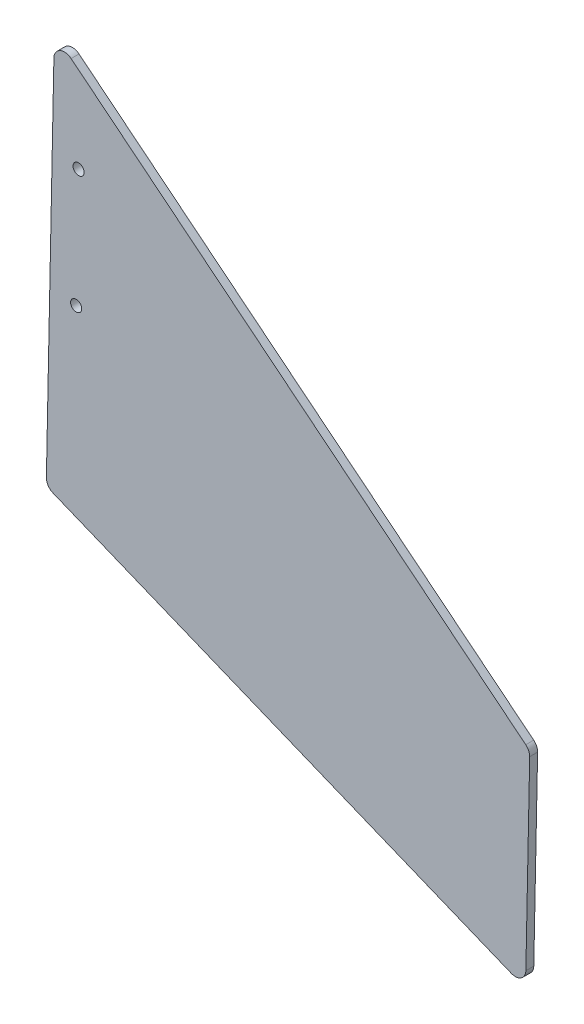
ISO-10303-21;
HEADER;
FILE_DESCRIPTION(('STEP AP214'),'2;1');
FILE_NAME('part.step','',(''),(''),'','','');
FILE_SCHEMA(('AUTOMOTIVE_DESIGN { 1 0 10303 214 1 1 1 1 }'));
ENDSEC;
DATA;
#1=APPLICATION_CONTEXT('core data for automotive mechanical design processes');
#2=APPLICATION_PROTOCOL_DEFINITION('international standard','automotive_design',2000,#1);
#3=PRODUCT_CONTEXT('',#1,'mechanical');
#4=PRODUCT('Part','Part','',(#3));
#5=PRODUCT_RELATED_PRODUCT_CATEGORY('part','',(#4));
#6=PRODUCT_DEFINITION_FORMATION('','',#4);
#7=PRODUCT_DEFINITION_CONTEXT('part definition',#1,'design');
#8=PRODUCT_DEFINITION('design','',#6,#7);
#9=PRODUCT_DEFINITION_SHAPE('','',#8);
#10=(LENGTH_UNIT() NAMED_UNIT(*) SI_UNIT(.MILLI.,.METRE.));
#11=(NAMED_UNIT(*) PLANE_ANGLE_UNIT() SI_UNIT($,.RADIAN.));
#12=(NAMED_UNIT(*) SI_UNIT($,.STERADIAN.) SOLID_ANGLE_UNIT());
#13=UNCERTAINTY_MEASURE_WITH_UNIT(LENGTH_MEASURE(1.E-05),#10,'distance_accuracy_value','');
#14=(GEOMETRIC_REPRESENTATION_CONTEXT(3) GLOBAL_UNCERTAINTY_ASSIGNED_CONTEXT((#13)) GLOBAL_UNIT_ASSIGNED_CONTEXT((#10,
#11,#12)) REPRESENTATION_CONTEXT('',''));
#15=CARTESIAN_POINT('',(0.,0.,0.));
#16=DIRECTION('',(0.,0.,1.));
#17=DIRECTION('',(1.,0.,0.));
#18=AXIS2_PLACEMENT_3D('',#15,#16,#17);
#19=CARTESIAN_POINT('',(178.455758645087,-224.,3.));
#20=DIRECTION('',(-0.999790806275875,0.0204534516948888,0.));
#21=DIRECTION('',(-0.0204534516948888,-0.999790806275875,0.));
#22=AXIS2_PLACEMENT_3D('',#19,#20,#21);
#23=PLANE('',#22);
#24=DIRECTION('',(0.0204534516948888,0.999790806275875,0.));
#25=VECTOR('',#24,1.);
#26=CARTESIAN_POINT('',(178.455758645087,-224.,3.));
#27=LINE('',#26,#25);
#28=CARTESIAN_POINT('',(178.574813412648,-218.180451112785,3.));
#29=VERTEX_POINT('',#28);
#30=CARTESIAN_POINT('',(180.025587190559,-147.264778453809,3.));
#31=VERTEX_POINT('',#30);
#32=EDGE_CURVE('E143',#29,#31,#27,.T.);
#33=ORIENTED_EDGE('',*,*,#32,.F.);
#34=DIRECTION('',(0.,0.,-1.));
#35=VECTOR('',#34,1.);
#36=CARTESIAN_POINT('',(178.574813412648,-218.180451112785,3.));
#37=LINE('',#36,#35);
#38=CARTESIAN_POINT('',(178.574813412648,-218.180451112785,0.));
#39=VERTEX_POINT('',#38);
#40=EDGE_CURVE('E11',#29,#39,#37,.T.);
#41=ORIENTED_EDGE('',*,*,#40,.T.);
#42=DIRECTION('',(0.0204534516948888,0.999790806275875,0.));
#43=VECTOR('',#42,1.);
#44=CARTESIAN_POINT('',(178.455758645087,-224.,0.));
#45=LINE('',#44,#43);
#46=CARTESIAN_POINT('',(180.025587190559,-147.264778453809,0.));
#47=VERTEX_POINT('',#46);
#48=EDGE_CURVE('E189',#39,#47,#45,.T.);
#49=ORIENTED_EDGE('',*,*,#48,.T.);
#50=DIRECTION('',(0.,0.,-1.));
#51=VECTOR('',#50,1.);
#52=CARTESIAN_POINT('',(180.025587190559,-147.264778453809,3.));
#53=LINE('',#52,#51);
#54=EDGE_CURVE('E54',#47,#31,#53,.F.);
#55=ORIENTED_EDGE('',*,*,#54,.T.);
#56=EDGE_LOOP('',(#33,#41,#49,#55));
#57=FACE_BOUND('',#56,.T.);
#58=ADVANCED_FACE('F45',(#57),#23,.F.);
#59=CARTESIAN_POINT('',(180.065729766655,-145.302558134247,3.));
#60=DIRECTION('',(-0.627983554847749,-0.778226608926208,0.));
#61=DIRECTION('',(0.778226608926208,-0.627983554847749,0.));
#62=AXIS2_PLACEMENT_3D('',#59,#60,#61);
#63=PLANE('',#62);
#64=DIRECTION('',(-0.778226608926207,0.627983554847749,0.));
#65=VECTOR('',#64,1.);
#66=CARTESIAN_POINT('',(180.065729766655,-145.302558134247,0.));
#67=LINE('',#66,#65);
#68=CARTESIAN_POINT('',(178.538358184846,-144.070058211324,0.));
#69=VERTEX_POINT('',#68);
#70=CARTESIAN_POINT('',(6.3443543096301,-5.11952447638928,0.));
#71=VERTEX_POINT('',#70);
#72=EDGE_CURVE('E150',#69,#71,#67,.T.);
#73=ORIENTED_EDGE('',*,*,#72,.T.);
#74=DIRECTION('',(0.,0.,-1.));
#75=VECTOR('',#74,1.);
#76=CARTESIAN_POINT('',(6.34435430963004,-5.11952447638922,3.));
#77=LINE('',#76,#75);
#78=CARTESIAN_POINT('',(6.3443543096301,-5.11952447638928,3.));
#79=VERTEX_POINT('',#78);
#80=EDGE_CURVE('E61',#71,#79,#77,.F.);
#81=ORIENTED_EDGE('',*,*,#80,.T.);
#82=DIRECTION('',(-0.778226608926207,0.627983554847749,0.));
#83=VECTOR('',#82,1.);
#84=CARTESIAN_POINT('',(180.065729766655,-145.302558134247,3.));
#85=LINE('',#84,#83);
#86=CARTESIAN_POINT('',(178.538358184846,-144.070058211324,3.));
#87=VERTEX_POINT('',#86);
#88=EDGE_CURVE('E148',#87,#79,#85,.T.);
#89=ORIENTED_EDGE('',*,*,#88,.F.);
#90=DIRECTION('',(0.,0.,-1.));
#91=VECTOR('',#90,1.);
#92=CARTESIAN_POINT('',(178.538358184846,-144.070058211324,3.));
#93=LINE('',#92,#91);
#94=EDGE_CURVE('E178',#87,#69,#93,.T.);
#95=ORIENTED_EDGE('',*,*,#94,.T.);
#96=EDGE_LOOP('',(#73,#81,#89,#95));
#97=FACE_BOUND('',#96,.T.);
#98=ADVANCED_FACE('F196',(#97),#63,.F.);
#99=CARTESIAN_POINT('',(0.,0.,3.));
#100=DIRECTION('',(0.999790806275875,-0.0204534516948889,0.));
#101=DIRECTION('',(0.0204534516948889,0.999790806275875,0.));
#102=AXIS2_PLACEMENT_3D('',#99,#100,#101);
#103=PLANE('',#102);
#104=DIRECTION('',(-0.0204534516948889,-0.999790806275875,0.));
#105=VECTOR('',#104,1.);
#106=CARTESIAN_POINT('',(0.,0.,0.));
#107=LINE('',#106,#105);
#108=CARTESIAN_POINT('',(-0.16674313486444,-8.15061710531453,0.));
#109=VERTEX_POINT('',#108);
#110=CARTESIAN_POINT('',(-3.01243768314587,-147.251796176821,0.));
#111=VERTEX_POINT('',#110);
#112=EDGE_CURVE('E144',#109,#111,#107,.T.);
#113=ORIENTED_EDGE('',*,*,#112,.T.);
#114=DIRECTION('',(0.,0.,-1.));
#115=VECTOR('',#114,1.);
#116=CARTESIAN_POINT('',(-3.01243768314587,-147.251796176821,3.));
#117=LINE('',#116,#115);
#118=CARTESIAN_POINT('',(-3.01243768314587,-147.251796176821,3.));
#119=VERTEX_POINT('',#118);
#120=EDGE_CURVE('E118',#111,#119,#117,.F.);
#121=ORIENTED_EDGE('',*,*,#120,.T.);
#122=DIRECTION('',(-0.0204534516948889,-0.999790806275875,0.));
#123=VECTOR('',#122,1.);
#124=CARTESIAN_POINT('',(0.,0.,3.));
#125=LINE('',#124,#123);
#126=CARTESIAN_POINT('',(-0.16674313486444,-8.15061710531453,3.));
#127=VERTEX_POINT('',#126);
#128=EDGE_CURVE('E204',#127,#119,#125,.T.);
#129=ORIENTED_EDGE('',*,*,#128,.F.);
#130=DIRECTION('',(0.,0.,-1.));
#131=VECTOR('',#130,1.);
#132=CARTESIAN_POINT('',(-0.16674313486444,-8.15061710531453,3.));
#133=LINE('',#132,#131);
#134=EDGE_CURVE('E124',#127,#109,#133,.T.);
#135=ORIENTED_EDGE('',*,*,#134,.T.);
#136=EDGE_LOOP('',(#113,#121,#129,#135));
#137=FACE_BOUND('',#136,.T.);
#138=ADVANCED_FACE('F252',(#137),#103,.F.);
#139=CARTESIAN_POINT('',(-3.06865969858375,-150.,3.));
#140=DIRECTION('',(0.37749641603102,0.92601104522772,0.));
#141=DIRECTION('',(-0.926011045227721,0.37749641603102,0.));
#142=AXIS2_PLACEMENT_3D('',#139,#140,#141);
#143=PLANE('',#142);
#144=DIRECTION('',(0.92601104522772,-0.37749641603102,0.));
#145=VECTOR('',#144,1.);
#146=CARTESIAN_POINT('',(-3.06865969858375,-150.,3.));
#147=LINE('',#146,#145);
#148=CARTESIAN_POINT('',(-0.523260122166441,-151.037654164512,3.));
#149=VERTEX_POINT('',#148);
#150=CARTESIAN_POINT('',(173.065664523421,-221.802681486916,3.));
#151=VERTEX_POINT('',#150);
#152=EDGE_CURVE('E134',#149,#151,#147,.T.);
#153=ORIENTED_EDGE('',*,*,#152,.F.);
#154=DIRECTION('',(0.,0.,-1.));
#155=VECTOR('',#154,1.);
#156=CARTESIAN_POINT('',(-0.523260122166442,-151.037654164512,3.));
#157=LINE('',#156,#155);
#158=CARTESIAN_POINT('',(-0.523260122166441,-151.037654164512,0.));
#159=VERTEX_POINT('',#158);
#160=EDGE_CURVE('E117',#149,#159,#157,.T.);
#161=ORIENTED_EDGE('',*,*,#160,.T.);
#162=DIRECTION('',(0.92601104522772,-0.37749641603102,0.));
#163=VECTOR('',#162,1.);
#164=CARTESIAN_POINT('',(-3.06865969858375,-150.,0.));
#165=LINE('',#164,#163);
#166=CARTESIAN_POINT('',(173.065664523421,-221.802681486916,0.));
#167=VERTEX_POINT('',#166);
#168=EDGE_CURVE('E131',#159,#167,#165,.T.);
#169=ORIENTED_EDGE('',*,*,#168,.T.);
#170=DIRECTION('',(0.,0.,-1.));
#171=VECTOR('',#170,1.);
#172=CARTESIAN_POINT('',(173.065664523421,-221.802681486916,3.));
#173=LINE('',#172,#171);
#174=EDGE_CURVE('E137',#167,#151,#173,.F.);
#175=ORIENTED_EDGE('',*,*,#174,.T.);
#176=EDGE_LOOP('',(#153,#161,#169,#175));
#177=FACE_BOUND('',#176,.T.);
#178=ADVANCED_FACE('F130',(#177),#143,.F.);
#179=CARTESIAN_POINT('',(0.,0.,3.));
#180=DIRECTION('',(0.,0.,-1.));
#181=DIRECTION('',(-1.,0.,0.));
#182=AXIS2_PLACEMENT_3D('',#179,#180,#181);
#183=PLANE('',#182);
#184=CARTESIAN_POINT('',(9.18378312199729,-40.,3.));
#185=DIRECTION('',(0.,0.,1.));
#186=DIRECTION('',(1.,0.,0.));
#187=AXIS2_PLACEMENT_3D('',#184,#185,#186);
#188=CIRCLE('',#187,2.1);
#189=CARTESIAN_POINT('',(11.2837831219973,-40.,3.));
#190=VERTEX_POINT('',#189);
#191=EDGE_CURVE('E217',#190,#190,#188,.T.);
#192=ORIENTED_EDGE('',*,*,#191,.F.);
#193=EDGE_LOOP('',(#192));
#194=FACE_BOUND('',#193,.T.);
#195=CARTESIAN_POINT('',(8.25928710538831,-85.1905444436696,3.));
#196=DIRECTION('',(0.,0.,1.));
#197=DIRECTION('',(1.,0.,0.));
#198=AXIS2_PLACEMENT_3D('',#195,#196,#197);
#199=CIRCLE('',#198,2.1);
#200=CARTESIAN_POINT('',(10.3592871053883,-85.1905444436696,3.));
#201=VERTEX_POINT('',#200);
#202=EDGE_CURVE('E213',#201,#201,#199,.T.);
#203=ORIENTED_EDGE('',*,*,#202,.F.);
#204=EDGE_LOOP('',(#203));
#205=FACE_BOUND('',#204,.T.);
#206=ORIENTED_EDGE('',*,*,#128,.T.);
#207=CARTESIAN_POINT('',(0.986725541957636,-147.333609983601,3.));
#208=DIRECTION('',(0.,0.,-1.));
#209=DIRECTION('',(-1.,0.,0.));
#210=AXIS2_PLACEMENT_3D('',#207,#208,#209);
#211=CIRCLE('',#210,4.);
#212=EDGE_CURVE('E175',#119,#149,#211,.F.);
#213=ORIENTED_EDGE('',*,*,#212,.T.);
#214=ORIENTED_EDGE('',*,*,#152,.T.);
#215=CARTESIAN_POINT('',(174.575650187545,-218.098637306005,3.));
#216=DIRECTION('',(0.,0.,-1.));
#217=DIRECTION('',(-1.,0.,0.));
#218=AXIS2_PLACEMENT_3D('',#215,#216,#217);
#219=CIRCLE('',#218,4.);
#220=EDGE_CURVE('E169',#151,#29,#219,.F.);
#221=ORIENTED_EDGE('',*,*,#220,.T.);
#222=ORIENTED_EDGE('',*,*,#32,.T.);
#223=CARTESIAN_POINT('',(176.026423965455,-147.182964647029,3.));
#224=DIRECTION('',(0.,0.,-1.));
#225=DIRECTION('',(-1.,0.,0.));
#226=AXIS2_PLACEMENT_3D('',#223,#224,#225);
#227=CIRCLE('',#226,4.);
#228=EDGE_CURVE('E68',#31,#87,#227,.F.);
#229=ORIENTED_EDGE('',*,*,#228,.T.);
#230=ORIENTED_EDGE('',*,*,#88,.T.);
#231=CARTESIAN_POINT('',(3.83242009023906,-8.23243091209408,3.));
#232=DIRECTION('',(0.,0.,-1.));
#233=DIRECTION('',(-1.,0.,0.));
#234=AXIS2_PLACEMENT_3D('',#231,#232,#233);
#235=CIRCLE('',#234,4.);
#236=EDGE_CURVE('E172',#79,#127,#235,.F.);
#237=ORIENTED_EDGE('',*,*,#236,.T.);
#238=EDGE_LOOP('',(#206,#213,#214,#221,#222,#229,#230,#237));
#239=FACE_BOUND('',#238,.T.);
#240=ADVANCED_FACE('F192',(#194,#205,#239),#183,.F.);
#241=CARTESIAN_POINT('',(0.,0.,0.));
#242=DIRECTION('',(0.,0.,-1.));
#243=DIRECTION('',(-1.,0.,0.));
#244=AXIS2_PLACEMENT_3D('',#241,#242,#243);
#245=PLANE('',#244);
#246=CARTESIAN_POINT('',(9.18378312199729,-40.,0.));
#247=DIRECTION('',(0.,0.,1.));
#248=DIRECTION('',(1.,0.,0.));
#249=AXIS2_PLACEMENT_3D('',#246,#247,#248);
#250=CIRCLE('',#249,2.1);
#251=CARTESIAN_POINT('',(11.2837831219973,-40.,0.));
#252=VERTEX_POINT('',#251);
#253=EDGE_CURVE('E199',#252,#252,#250,.T.);
#254=ORIENTED_EDGE('',*,*,#253,.T.);
#255=EDGE_LOOP('',(#254));
#256=FACE_BOUND('',#255,.T.);
#257=CARTESIAN_POINT('',(8.25928710538831,-85.1905444436696,0.));
#258=DIRECTION('',(0.,0.,1.));
#259=DIRECTION('',(1.,0.,0.));
#260=AXIS2_PLACEMENT_3D('',#257,#258,#259);
#261=CIRCLE('',#260,2.1);
#262=CARTESIAN_POINT('',(10.3592871053883,-85.1905444436696,0.));
#263=VERTEX_POINT('',#262);
#264=EDGE_CURVE('E209',#263,#263,#261,.T.);
#265=ORIENTED_EDGE('',*,*,#264,.T.);
#266=EDGE_LOOP('',(#265));
#267=FACE_BOUND('',#266,.T.);
#268=ORIENTED_EDGE('',*,*,#168,.F.);
#269=CARTESIAN_POINT('',(0.986725541957636,-147.333609983601,0.));
#270=DIRECTION('',(0.,0.,-1.));
#271=DIRECTION('',(-1.,0.,0.));
#272=AXIS2_PLACEMENT_3D('',#269,#270,#271);
#273=CIRCLE('',#272,4.);
#274=EDGE_CURVE('E113',#159,#111,#273,.T.);
#275=ORIENTED_EDGE('',*,*,#274,.T.);
#276=ORIENTED_EDGE('',*,*,#112,.F.);
#277=CARTESIAN_POINT('',(3.83242009023906,-8.23243091209408,0.));
#278=DIRECTION('',(0.,0.,-1.));
#279=DIRECTION('',(-1.,0.,0.));
#280=AXIS2_PLACEMENT_3D('',#277,#278,#279);
#281=CIRCLE('',#280,4.);
#282=EDGE_CURVE('E125',#109,#71,#281,.T.);
#283=ORIENTED_EDGE('',*,*,#282,.T.);
#284=ORIENTED_EDGE('',*,*,#72,.F.);
#285=CARTESIAN_POINT('',(176.026423965455,-147.182964647029,0.));
#286=DIRECTION('',(0.,0.,-1.));
#287=DIRECTION('',(-1.,0.,0.));
#288=AXIS2_PLACEMENT_3D('',#285,#286,#287);
#289=CIRCLE('',#288,4.);
#290=EDGE_CURVE('E136',#69,#47,#289,.T.);
#291=ORIENTED_EDGE('',*,*,#290,.T.);
#292=ORIENTED_EDGE('',*,*,#48,.F.);
#293=CARTESIAN_POINT('',(174.575650187545,-218.098637306005,0.));
#294=DIRECTION('',(0.,0.,-1.));
#295=DIRECTION('',(-1.,0.,0.));
#296=AXIS2_PLACEMENT_3D('',#293,#294,#295);
#297=CIRCLE('',#296,4.);
#298=EDGE_CURVE('E141',#39,#167,#297,.T.);
#299=ORIENTED_EDGE('',*,*,#298,.T.);
#300=EDGE_LOOP('',(#268,#275,#276,#283,#284,#291,#292,#299));
#301=FACE_BOUND('',#300,.T.);
#302=ADVANCED_FACE('F139',(#256,#267,#301),#245,.T.);
#303=CARTESIAN_POINT('',(0.986725541957636,-147.333609983601,3.));
#304=DIRECTION('',(0.,0.,-1.));
#305=DIRECTION('',(-1.,0.,0.));
#306=AXIS2_PLACEMENT_3D('',#303,#304,#305);
#307=CYLINDRICAL_SURFACE('',#306,4.);
#308=ORIENTED_EDGE('',*,*,#212,.F.);
#309=ORIENTED_EDGE('',*,*,#120,.F.);
#310=ORIENTED_EDGE('',*,*,#274,.F.);
#311=ORIENTED_EDGE('',*,*,#160,.F.);
#312=EDGE_LOOP('',(#308,#309,#310,#311));
#313=FACE_BOUND('',#312,.T.);
#314=ADVANCED_FACE('F116',(#313),#307,.T.);
#315=CARTESIAN_POINT('',(3.83242009023906,-8.23243091209408,3.));
#316=DIRECTION('',(0.,0.,-1.));
#317=DIRECTION('',(-1.,0.,0.));
#318=AXIS2_PLACEMENT_3D('',#315,#316,#317);
#319=CYLINDRICAL_SURFACE('',#318,4.);
#320=ORIENTED_EDGE('',*,*,#236,.F.);
#321=ORIENTED_EDGE('',*,*,#80,.F.);
#322=ORIENTED_EDGE('',*,*,#282,.F.);
#323=ORIENTED_EDGE('',*,*,#134,.F.);
#324=EDGE_LOOP('',(#320,#321,#322,#323));
#325=FACE_BOUND('',#324,.T.);
#326=ADVANCED_FACE('F258',(#325),#319,.T.);
#327=CARTESIAN_POINT('',(174.575650187545,-218.098637306005,3.));
#328=DIRECTION('',(0.,0.,-1.));
#329=DIRECTION('',(-1.,0.,0.));
#330=AXIS2_PLACEMENT_3D('',#327,#328,#329);
#331=CYLINDRICAL_SURFACE('',#330,4.);
#332=ORIENTED_EDGE('',*,*,#220,.F.);
#333=ORIENTED_EDGE('',*,*,#174,.F.);
#334=ORIENTED_EDGE('',*,*,#298,.F.);
#335=ORIENTED_EDGE('',*,*,#40,.F.);
#336=EDGE_LOOP('',(#332,#333,#334,#335));
#337=FACE_BOUND('',#336,.T.);
#338=ADVANCED_FACE('F245',(#337),#331,.T.);
#339=CARTESIAN_POINT('',(176.026423965455,-147.182964647029,3.));
#340=DIRECTION('',(0.,0.,-1.));
#341=DIRECTION('',(-1.,0.,0.));
#342=AXIS2_PLACEMENT_3D('',#339,#340,#341);
#343=CYLINDRICAL_SURFACE('',#342,4.);
#344=ORIENTED_EDGE('',*,*,#228,.F.);
#345=ORIENTED_EDGE('',*,*,#54,.F.);
#346=ORIENTED_EDGE('',*,*,#290,.F.);
#347=ORIENTED_EDGE('',*,*,#94,.F.);
#348=EDGE_LOOP('',(#344,#345,#346,#347));
#349=FACE_BOUND('',#348,.T.);
#350=ADVANCED_FACE('F47',(#349),#343,.T.);
#351=CARTESIAN_POINT('',(8.25928710538831,-85.1905444436696,0.));
#352=DIRECTION('',(0.,0.,1.));
#353=DIRECTION('',(1.,0.,0.));
#354=AXIS2_PLACEMENT_3D('',#351,#352,#353);
#355=CYLINDRICAL_SURFACE('',#354,2.1);
#356=ORIENTED_EDGE('',*,*,#264,.F.);
#357=EDGE_LOOP('',(#356));
#358=FACE_BOUND('',#357,.T.);
#359=ORIENTED_EDGE('',*,*,#202,.T.);
#360=EDGE_LOOP('',(#359));
#361=FACE_BOUND('',#360,.T.);
#362=ADVANCED_FACE('F230',(#358,#361),#355,.F.);
#363=CARTESIAN_POINT('',(9.18378312199729,-40.,0.));
#364=DIRECTION('',(0.,0.,1.));
#365=DIRECTION('',(1.,0.,0.));
#366=AXIS2_PLACEMENT_3D('',#363,#364,#365);
#367=CYLINDRICAL_SURFACE('',#366,2.1);
#368=ORIENTED_EDGE('',*,*,#253,.F.);
#369=EDGE_LOOP('',(#368));
#370=FACE_BOUND('',#369,.T.);
#371=ORIENTED_EDGE('',*,*,#191,.T.);
#372=EDGE_LOOP('',(#371));
#373=FACE_BOUND('',#372,.T.);
#374=ADVANCED_FACE('F227',(#370,#373),#367,.F.);
#375=CLOSED_SHELL('',(#58,#98,#138,#178,#240,#302,#314,#326,#338,#350,#362,#374));
#376=MANIFOLD_SOLID_BREP('B2',#375);
#377=ADVANCED_BREP_SHAPE_REPRESENTATION('',(#18,#376),#14);
#378=SHAPE_DEFINITION_REPRESENTATION(#9,#377);
ENDSEC;
END-ISO-10303-21;
